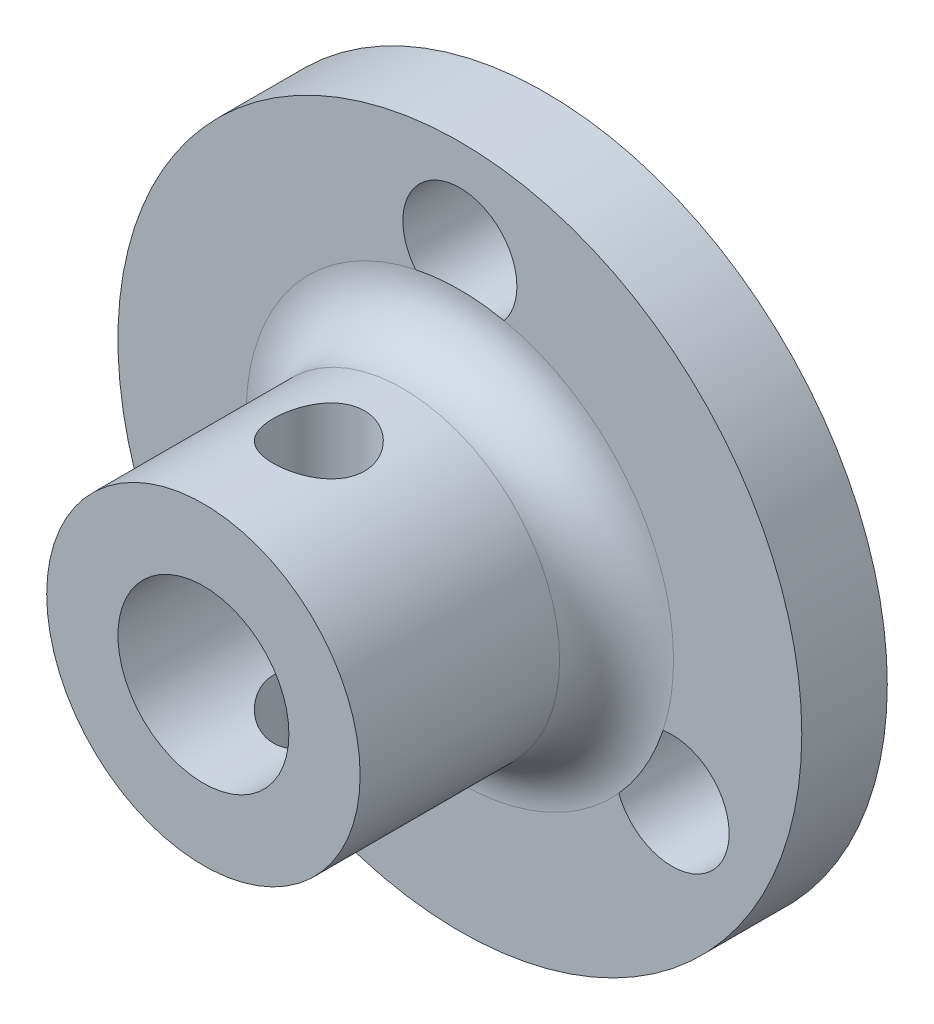
ISO-10303-21;
HEADER;
FILE_DESCRIPTION(('STEP AP214'),'2;1');
FILE_NAME('part.step','',(''),(''),'','','');
FILE_SCHEMA(('AUTOMOTIVE_DESIGN { 1 0 10303 214 1 1 1 1 }'));
ENDSEC;
DATA;
#1=APPLICATION_CONTEXT('core data for automotive mechanical design processes');
#2=APPLICATION_PROTOCOL_DEFINITION('international standard','automotive_design',2000,#1);
#3=PRODUCT_CONTEXT('',#1,'mechanical');
#4=PRODUCT('Part','Part','',(#3));
#5=PRODUCT_RELATED_PRODUCT_CATEGORY('part','',(#4));
#6=PRODUCT_DEFINITION_FORMATION('','',#4);
#7=PRODUCT_DEFINITION_CONTEXT('part definition',#1,'design');
#8=PRODUCT_DEFINITION('design','',#6,#7);
#9=PRODUCT_DEFINITION_SHAPE('','',#8);
#10=(LENGTH_UNIT() NAMED_UNIT(*) SI_UNIT(.MILLI.,.METRE.));
#11=(NAMED_UNIT(*) PLANE_ANGLE_UNIT() SI_UNIT($,.RADIAN.));
#12=(NAMED_UNIT(*) SI_UNIT($,.STERADIAN.) SOLID_ANGLE_UNIT());
#13=UNCERTAINTY_MEASURE_WITH_UNIT(LENGTH_MEASURE(1.E-05),#10,'distance_accuracy_value','');
#14=(GEOMETRIC_REPRESENTATION_CONTEXT(3) GLOBAL_UNCERTAINTY_ASSIGNED_CONTEXT((#13)) GLOBAL_UNIT_ASSIGNED_CONTEXT((#10,
#11,#12)) REPRESENTATION_CONTEXT('',''));
#15=CARTESIAN_POINT('',(0.,0.,0.));
#16=DIRECTION('',(0.,0.,1.));
#17=DIRECTION('',(1.,0.,0.));
#18=AXIS2_PLACEMENT_3D('',#15,#16,#17);
#19=CARTESIAN_POINT('',(0.,0.,12.));
#20=DIRECTION('',(0.,0.,-1.));
#21=DIRECTION('',(-1.,0.,0.));
#22=AXIS2_PLACEMENT_3D('',#19,#20,#21);
#23=CYLINDRICAL_SURFACE('',#22,3.);
#24=CARTESIAN_POINT('',(0.,-3.,6.34948666700832));
#25=CARTESIAN_POINT('',(0.0834280085828025,-2.99999516830785,6.34949208358249));
#26=CARTESIAN_POINT('',(0.166934582506535,-2.99648378720922,6.35604985983169));
#27=CARTESIAN_POINT('',(0.331436394670318,-2.98278259335468,6.38197006874192));
#28=CARTESIAN_POINT('',(0.412427539682874,-2.97258243738723,6.40135233301597));
#29=CARTESIAN_POINT('',(0.569277189891047,-2.94656073601314,6.45192634672432));
#30=CARTESIAN_POINT('',(0.645155024474136,-2.93076195982554,6.4830702953871));
#31=CARTESIAN_POINT('',(0.790470948459431,-2.89495499745187,6.55601177043328));
#32=CARTESIAN_POINT('',(0.859909008635982,-2.87494679216347,6.59780934516286));
#33=CARTESIAN_POINT('',(0.995534638915594,-2.83095801330151,6.69398979046827));
#34=CARTESIAN_POINT('',(1.06120405491229,-2.80680229614067,6.74902187403424));
#35=CARTESIAN_POINT('',(1.18286806133739,-2.75774084341935,6.8686929583954));
#36=CARTESIAN_POINT('',(1.23885417984541,-2.73283447325624,6.93334028052644));
#37=CARTESIAN_POINT('',(1.34470883896841,-2.68244281334124,7.07744278391342));
#38=CARTESIAN_POINT('',(1.39355367383636,-2.65711191284795,7.15771076412944));
#39=CARTESIAN_POINT('',(1.4768528324153,-2.6117367722112,7.32677802950124));
#40=CARTESIAN_POINT('',(1.51131827632936,-2.59168845125878,7.41557065656263));
#41=CARTESIAN_POINT('',(1.56248710339327,-2.56114789725882,7.59359520577738));
#42=CARTESIAN_POINT('',(1.5801662348633,-2.55013659138239,7.68245261120152));
#43=CARTESIAN_POINT('',(1.60018994479719,-2.53762662306211,7.86249441092746));
#44=CARTESIAN_POINT('',(1.60255389391569,-2.53611594428853,7.9536757192737));
#45=CARTESIAN_POINT('',(1.59259204330144,-2.54237297611912,8.12193039830425));
#46=CARTESIAN_POINT('',(1.5822864459542,-2.54886502713221,8.19918356025348));
#47=CARTESIAN_POINT('',(1.55082691014658,-2.56812634563423,8.35063591489162));
#48=CARTESIAN_POINT('',(1.52966860751486,-2.58089813829439,8.42483386601958));
#49=CARTESIAN_POINT('',(1.47678050478154,-2.6115255571428,8.57016272015564));
#50=CARTESIAN_POINT('',(1.44482388986181,-2.62948894800927,8.6411872731784));
#51=CARTESIAN_POINT('',(1.37143304593392,-2.66850094165746,8.77722571972306));
#52=CARTESIAN_POINT('',(1.32999461708737,-2.68955091010761,8.84223693174635));
#53=CARTESIAN_POINT('',(1.23173704487371,-2.73609049880501,8.97445838943488));
#54=CARTESIAN_POINT('',(1.17355258231979,-2.76177798986485,9.04058813750174));
#55=CARTESIAN_POINT('',(1.0469027467487,-2.81223117246244,9.16263738238821));
#56=CARTESIAN_POINT('',(0.978431146098924,-2.83699629420455,9.21855064859457));
#57=CARTESIAN_POINT('',(0.828044154062363,-2.88460021999069,9.32176209683673));
#58=CARTESIAN_POINT('',(0.745570968821584,-2.90723646176344,9.36834888339614));
#59=CARTESIAN_POINT('',(0.572453719472289,-2.9462079060851,9.44658243336212));
#60=CARTESIAN_POINT('',(0.481817034499116,-2.96254873003402,9.47824253101455));
#61=CARTESIAN_POINT('',(0.30366442791181,-2.9858199122846,9.52284189182288));
#62=CARTESIAN_POINT('',(0.216600262764062,-2.99346409984953,9.53720806962829));
#63=CARTESIAN_POINT('',(0.0409791950824068,-3.00100442054404,9.55138167340918));
#64=CARTESIAN_POINT('',(-0.0475768145688012,-3.00090503432182,9.5511975186129));
#65=CARTESIAN_POINT('',(-0.215091919521215,-2.99334764517664,9.53698680934697));
#66=CARTESIAN_POINT('',(-0.294192898535464,-2.98655794488573,9.5242173855118));
#67=CARTESIAN_POINT('',(-0.448939109663164,-2.96724376655693,9.48727178281248));
#68=CARTESIAN_POINT('',(-0.524583981374494,-2.95471869192973,9.46309441729492));
#69=CARTESIAN_POINT('',(-0.672500335044405,-2.92465141623378,9.40353678207186));
#70=CARTESIAN_POINT('',(-0.744640666753739,-2.9069918992478,9.36789219717175));
#71=CARTESIAN_POINT('',(-0.882124314821924,-2.86826876163522,9.28673635840511));
#72=CARTESIAN_POINT('',(-0.94746496400545,-2.84720381343929,9.24122125425453));
#73=CARTESIAN_POINT('',(-1.07697928921282,-2.80095291390707,9.13599706479286));
#74=CARTESIAN_POINT('',(-1.1402697302165,-2.77556745933858,9.0752873323506));
#75=CARTESIAN_POINT('',(-1.25621972548301,-2.72505417098626,8.94426099517801));
#76=CARTESIAN_POINT('',(-1.30886943094942,-2.69992659611925,8.87393559042423));
#77=CARTESIAN_POINT('',(-1.40548153261782,-2.65099028655931,8.71983369465826));
#78=CARTESIAN_POINT('',(-1.44862048937835,-2.62738421458254,8.63547038944949));
#79=CARTESIAN_POINT('',(-1.51964969635315,-2.58695870125936,8.45906648683598));
#80=CARTESIAN_POINT('',(-1.54756166073897,-2.57012960475316,8.36703703876482));
#81=CARTESIAN_POINT('',(-1.5845909036139,-2.54745026922036,8.18745897281323));
#82=CARTESIAN_POINT('',(-1.59528122309048,-2.54068617365327,8.10035429957741));
#83=CARTESIAN_POINT('',(-1.60220766902338,-2.53632719775287,7.92536603864759));
#84=CARTESIAN_POINT('',(-1.59845364948012,-2.53872606639137,7.83748302276316));
#85=CARTESIAN_POINT('',(-1.57811270148832,-2.55140495355656,7.67479395729224));
#86=CARTESIAN_POINT('',(-1.56314118274069,-2.5606915110498,7.5996968855534));
#87=CARTESIAN_POINT('',(-1.52298687295876,-2.58477383442181,7.45321875192609));
#88=CARTESIAN_POINT('',(-1.4978002949924,-2.59957164326813,7.38183907923955));
#89=CARTESIAN_POINT('',(-1.43616070422438,-2.63415331148715,7.23967710791558));
#90=CARTESIAN_POINT('',(-1.3990864148575,-2.65419696823125,7.16922953217823));
#91=CARTESIAN_POINT('',(-1.31534245335434,-2.6966792141344,7.03508279548737));
#92=CARTESIAN_POINT('',(-1.26866761463333,-2.71911908969112,6.97138729628419));
#93=CARTESIAN_POINT('',(-1.15916720525938,-2.76774539611286,6.84294047925392));
#94=CARTESIAN_POINT('',(-1.09498203667427,-2.79400424140764,6.77936918613531));
#95=CARTESIAN_POINT('',(-0.956300329149746,-2.8444566012759,6.66354212620747));
#96=CARTESIAN_POINT('',(-0.881797165766555,-2.86864877272258,6.61129368470821));
#97=CARTESIAN_POINT('',(-0.722044005153541,-2.91302030182076,6.51861874724413));
#98=CARTESIAN_POINT('',(-0.636577331123639,-2.93308821046928,6.47850941454085));
#99=CARTESIAN_POINT('',(-0.458798662878496,-2.9660771301132,6.41377942189835));
#100=CARTESIAN_POINT('',(-0.36650569376879,-2.97901721406285,6.38911740282482));
#101=CARTESIAN_POINT('',(-0.227615355842192,-2.99169552229494,6.36510132443239));
#102=CARTESIAN_POINT('',(-0.182355494246517,-2.9947988863485,6.35925689859637));
#103=CARTESIAN_POINT('',(-0.0914049548856031,-2.9989524612278,6.35144806269995));
#104=CARTESIAN_POINT('',(-0.0457142719789323,-3.00000264751962,6.34948369900334));
#105=CARTESIAN_POINT('',(0.,-3.,6.34948666700832));
#106=B_SPLINE_CURVE_WITH_KNOTS('',3,(#24,#25,#26,#27,#28,#29,#30,#31,#32,#33,#34,#35,#36,#37,
#38,#39,#40,#41,#42,#43,#44,#45,#46,#47,#48,#49,#50,#51,#52,#53,#54,#55,#56,#57,#58,#59,#60,#61,
#62,#63,#64,#65,#66,#67,#68,#69,#70,#71,#72,#73,#74,#75,#76,#77,#78,#79,#80,#81,#82,#83,#84,#85,
#86,#87,#88,#89,#90,#91,#92,#93,#94,#95,#96,#97,#98,#99,#100,#101,#102,#103,#104,#105),
.UNSPECIFIED.,.T.,.F.,(4,2,2,2,2,2,2,2,2,2,2,2,2,2,2,2,2,2,2,2,2,2,2,2,2,2,2,2,2,2,2,2,2,2,2,2,
2,2,2,2,4),(0.,0.250099571937984,0.500586801159414,0.750066790862757,0.99954791272674,
1.26551787503545,1.53171937023862,1.82220042181316,2.11245641359362,2.38456600858369,
2.65633137184324,2.88985639109234,3.12347539088301,3.3623427439711,3.60131610556615,
3.87540340557937,4.14965730631696,4.44024459698544,4.7305718072894,4.99480330643343,
5.2588819149833,5.49900649956853,5.73915606740714,5.98529384057671,6.2315278002262,
6.50427545175262,6.77727440700572,7.06865169074469,7.3596123678454,7.62207574902765,
7.8843601081339,8.1147617764152,8.34524893751089,8.59058452776185,8.83605249367796,
9.11702751803745,9.39818377987291,9.68615329689657,9.9733484617649,10.110388568954,
10.2474303136582),.UNSPECIFIED.);
#107=CARTESIAN_POINT('',(0.,-3.,6.34948666700832));
#108=VERTEX_POINT('',#107);
#109=EDGE_CURVE('E126',#108,#108,#106,.T.);
#110=ORIENTED_EDGE('',*,*,#109,.T.);
#111=EDGE_LOOP('',(#110));
#112=FACE_BOUND('',#111,.T.);
#113=CARTESIAN_POINT('',(0.,0.,12.));
#114=DIRECTION('',(0.,0.,1.));
#115=DIRECTION('',(1.,0.,0.));
#116=AXIS2_PLACEMENT_3D('',#113,#114,#115);
#117=CIRCLE('',#116,3.);
#118=CARTESIAN_POINT('',(3.,0.,12.));
#119=VERTEX_POINT('',#118);
#120=EDGE_CURVE('E166',#119,#119,#117,.T.);
#121=ORIENTED_EDGE('',*,*,#120,.T.);
#122=EDGE_LOOP('',(#121));
#123=FACE_BOUND('',#122,.T.);
#124=CARTESIAN_POINT('',(0.,0.,0.));
#125=DIRECTION('',(0.,0.,1.));
#126=DIRECTION('',(1.,0.,0.));
#127=AXIS2_PLACEMENT_3D('',#124,#125,#126);
#128=CIRCLE('',#127,3.);
#129=CARTESIAN_POINT('',(3.,0.,0.));
#130=VERTEX_POINT('',#129);
#131=EDGE_CURVE('E169',#130,#130,#128,.T.);
#132=ORIENTED_EDGE('',*,*,#131,.F.);
#133=EDGE_LOOP('',(#132));
#134=FACE_BOUND('',#133,.T.);
#135=CARTESIAN_POINT('',(0.,3.,6.34948666700832));
#136=CARTESIAN_POINT('',(-0.0834280085828025,2.99999516830785,6.34949208358249));
#137=CARTESIAN_POINT('',(-0.166934582506535,2.99648378720922,6.35604985983169));
#138=CARTESIAN_POINT('',(-0.331436394670318,2.98278259335468,6.38197006874192));
#139=CARTESIAN_POINT('',(-0.412427539682874,2.97258243738723,6.40135233301597));
#140=CARTESIAN_POINT('',(-0.569277189891047,2.94656073601314,6.45192634672432));
#141=CARTESIAN_POINT('',(-0.645155024474136,2.93076195982554,6.4830702953871));
#142=CARTESIAN_POINT('',(-0.790470948459431,2.89495499745187,6.55601177043328));
#143=CARTESIAN_POINT('',(-0.859909008635982,2.87494679216347,6.59780934516286));
#144=CARTESIAN_POINT('',(-0.995534638915594,2.83095801330151,6.69398979046827));
#145=CARTESIAN_POINT('',(-1.06120405491229,2.80680229614067,6.74902187403424));
#146=CARTESIAN_POINT('',(-1.18286806133739,2.75774084341935,6.8686929583954));
#147=CARTESIAN_POINT('',(-1.23885417984541,2.73283447325624,6.93334028052644));
#148=CARTESIAN_POINT('',(-1.34470883896841,2.68244281334124,7.07744278391342));
#149=CARTESIAN_POINT('',(-1.39355367383636,2.65711191284795,7.15771076412944));
#150=CARTESIAN_POINT('',(-1.4768528324153,2.6117367722112,7.32677802950124));
#151=CARTESIAN_POINT('',(-1.51131827632936,2.59168845125878,7.41557065656263));
#152=CARTESIAN_POINT('',(-1.56248710339327,2.56114789725882,7.59359520577738));
#153=CARTESIAN_POINT('',(-1.5801662348633,2.55013659138239,7.68245261120152));
#154=CARTESIAN_POINT('',(-1.60018994479719,2.53762662306211,7.86249441092746));
#155=CARTESIAN_POINT('',(-1.60255389391569,2.53611594428853,7.9536757192737));
#156=CARTESIAN_POINT('',(-1.59259204330144,2.54237297611912,8.12193039830425));
#157=CARTESIAN_POINT('',(-1.5822864459542,2.54886502713221,8.19918356025348));
#158=CARTESIAN_POINT('',(-1.55082691014658,2.56812634563423,8.35063591489162));
#159=CARTESIAN_POINT('',(-1.52966860751486,2.58089813829439,8.42483386601958));
#160=CARTESIAN_POINT('',(-1.47678050478154,2.6115255571428,8.57016272015564));
#161=CARTESIAN_POINT('',(-1.44482388986181,2.62948894800927,8.6411872731784));
#162=CARTESIAN_POINT('',(-1.37143304593392,2.66850094165746,8.77722571972306));
#163=CARTESIAN_POINT('',(-1.32999461708737,2.68955091010761,8.84223693174635));
#164=CARTESIAN_POINT('',(-1.23173704487371,2.73609049880501,8.97445838943488));
#165=CARTESIAN_POINT('',(-1.17355258231979,2.76177798986485,9.04058813750174));
#166=CARTESIAN_POINT('',(-1.0469027467487,2.81223117246244,9.16263738238821));
#167=CARTESIAN_POINT('',(-0.978431146098924,2.83699629420455,9.21855064859457));
#168=CARTESIAN_POINT('',(-0.828044154062363,2.88460021999069,9.32176209683673));
#169=CARTESIAN_POINT('',(-0.745570968821584,2.90723646176344,9.36834888339614));
#170=CARTESIAN_POINT('',(-0.572453719472289,2.9462079060851,9.44658243336212));
#171=CARTESIAN_POINT('',(-0.481817034499116,2.96254873003402,9.47824253101455));
#172=CARTESIAN_POINT('',(-0.30366442791181,2.9858199122846,9.52284189182288));
#173=CARTESIAN_POINT('',(-0.216600262764062,2.99346409984953,9.53720806962829));
#174=CARTESIAN_POINT('',(-0.0409791950824068,3.00100442054404,9.55138167340918));
#175=CARTESIAN_POINT('',(0.0475768145688012,3.00090503432182,9.5511975186129));
#176=CARTESIAN_POINT('',(0.215091919521215,2.99334764517664,9.53698680934697));
#177=CARTESIAN_POINT('',(0.294192898535464,2.98655794488573,9.5242173855118));
#178=CARTESIAN_POINT('',(0.448939109663164,2.96724376655693,9.48727178281248));
#179=CARTESIAN_POINT('',(0.524583981374494,2.95471869192973,9.46309441729492));
#180=CARTESIAN_POINT('',(0.672500335044405,2.92465141623378,9.40353678207186));
#181=CARTESIAN_POINT('',(0.744640666753739,2.9069918992478,9.36789219717175));
#182=CARTESIAN_POINT('',(0.882124314821924,2.86826876163522,9.28673635840511));
#183=CARTESIAN_POINT('',(0.94746496400545,2.84720381343929,9.24122125425453));
#184=CARTESIAN_POINT('',(1.07697928921282,2.80095291390707,9.13599706479286));
#185=CARTESIAN_POINT('',(1.1402697302165,2.77556745933858,9.0752873323506));
#186=CARTESIAN_POINT('',(1.25621972548301,2.72505417098626,8.94426099517801));
#187=CARTESIAN_POINT('',(1.30886943094942,2.69992659611925,8.87393559042423));
#188=CARTESIAN_POINT('',(1.40548153261782,2.65099028655931,8.71983369465826));
#189=CARTESIAN_POINT('',(1.44862048937835,2.62738421458254,8.63547038944949));
#190=CARTESIAN_POINT('',(1.51964969635315,2.58695870125936,8.45906648683598));
#191=CARTESIAN_POINT('',(1.54756166073897,2.57012960475316,8.36703703876482));
#192=CARTESIAN_POINT('',(1.5845909036139,2.54745026922036,8.18745897281323));
#193=CARTESIAN_POINT('',(1.59528122309048,2.54068617365327,8.10035429957741));
#194=CARTESIAN_POINT('',(1.60220766902338,2.53632719775287,7.92536603864759));
#195=CARTESIAN_POINT('',(1.59845364948012,2.53872606639137,7.83748302276316));
#196=CARTESIAN_POINT('',(1.57811270148832,2.55140495355656,7.67479395729224));
#197=CARTESIAN_POINT('',(1.56314118274069,2.5606915110498,7.5996968855534));
#198=CARTESIAN_POINT('',(1.52298687295876,2.58477383442181,7.45321875192609));
#199=CARTESIAN_POINT('',(1.4978002949924,2.59957164326813,7.38183907923955));
#200=CARTESIAN_POINT('',(1.43616070422438,2.63415331148715,7.23967710791558));
#201=CARTESIAN_POINT('',(1.3990864148575,2.65419696823125,7.16922953217823));
#202=CARTESIAN_POINT('',(1.31534245335434,2.6966792141344,7.03508279548737));
#203=CARTESIAN_POINT('',(1.26866761463333,2.71911908969112,6.97138729628419));
#204=CARTESIAN_POINT('',(1.15916720525938,2.76774539611286,6.84294047925392));
#205=CARTESIAN_POINT('',(1.09498203667427,2.79400424140764,6.77936918613531));
#206=CARTESIAN_POINT('',(0.956300329149746,2.8444566012759,6.66354212620747));
#207=CARTESIAN_POINT('',(0.881797165766555,2.86864877272258,6.61129368470821));
#208=CARTESIAN_POINT('',(0.722044005153541,2.91302030182076,6.51861874724413));
#209=CARTESIAN_POINT('',(0.636577331123639,2.93308821046928,6.47850941454085));
#210=CARTESIAN_POINT('',(0.458798662878496,2.9660771301132,6.41377942189835));
#211=CARTESIAN_POINT('',(0.36650569376879,2.97901721406285,6.38911740282482));
#212=CARTESIAN_POINT('',(0.227615355842192,2.99169552229494,6.36510132443239));
#213=CARTESIAN_POINT('',(0.182355494246517,2.9947988863485,6.35925689859637));
#214=CARTESIAN_POINT('',(0.0914049548856031,2.9989524612278,6.35144806269995));
#215=CARTESIAN_POINT('',(0.0457142719789323,3.00000264751962,6.34948369900334));
#216=CARTESIAN_POINT('',(0.,3.,6.34948666700832));
#217=B_SPLINE_CURVE_WITH_KNOTS('',3,(#135,#136,#137,#138,#139,#140,#141,#142,#143,#144,#145,
#146,#147,#148,#149,#150,#151,#152,#153,#154,#155,#156,#157,#158,#159,#160,#161,#162,#163,#164,
#165,#166,#167,#168,#169,#170,#171,#172,#173,#174,#175,#176,#177,#178,#179,#180,#181,#182,#183,
#184,#185,#186,#187,#188,#189,#190,#191,#192,#193,#194,#195,#196,#197,#198,#199,#200,#201,#202,
#203,#204,#205,#206,#207,#208,#209,#210,#211,#212,#213,#214,#215,#216),.UNSPECIFIED.,.T.,.F.,(4,
2,2,2,2,2,2,2,2,2,2,2,2,2,2,2,2,2,2,2,2,2,2,2,2,2,2,2,2,2,2,2,2,2,2,2,2,2,2,2,4),(0.,
0.250099571937984,0.500586801159414,0.750066790862757,0.99954791272674,1.26551787503545,
1.53171937023862,1.82220042181316,2.11245641359362,2.38456600858369,2.65633137184324,
2.88985639109234,3.12347539088301,3.3623427439711,3.60131610556615,3.87540340557937,
4.14965730631696,4.44024459698544,4.7305718072894,4.99480330643343,5.2588819149833,
5.49900649956853,5.73915606740714,5.98529384057671,6.2315278002262,6.50427545175262,
6.77727440700572,7.06865169074469,7.3596123678454,7.62207574902765,7.8843601081339,
8.1147617764152,8.34524893751089,8.59058452776185,8.83605249367796,9.11702751803745,
9.39818377987291,9.68615329689657,9.9733484617649,10.110388568954,10.2474303136582),.UNSPECIFIED.);
#218=CARTESIAN_POINT('',(0.,3.,6.34948666700832));
#219=VERTEX_POINT('',#218);
#220=EDGE_CURVE('E132',#219,#219,#217,.T.);
#221=ORIENTED_EDGE('',*,*,#220,.T.);
#222=EDGE_LOOP('',(#221));
#223=FACE_BOUND('',#222,.T.);
#224=ADVANCED_FACE('F35',(#112,#123,#134,#223),#23,.F.);
#225=CARTESIAN_POINT('',(0.,0.,12.));
#226=DIRECTION('',(0.,0.,-1.));
#227=DIRECTION('',(-1.,0.,0.));
#228=AXIS2_PLACEMENT_3D('',#225,#226,#227);
#229=CYLINDRICAL_SURFACE('',#228,5.5);
#230=CARTESIAN_POINT('',(0.,0.,5.));
#231=DIRECTION('',(0.,0.,1.));
#232=DIRECTION('',(1.,0.,0.));
#233=AXIS2_PLACEMENT_3D('',#230,#231,#232);
#234=CIRCLE('',#233,5.5);
#235=CARTESIAN_POINT('',(5.5,0.,5.));
#236=VERTEX_POINT('',#235);
#237=EDGE_CURVE('E101',#236,#236,#234,.T.);
#238=ORIENTED_EDGE('',*,*,#237,.T.);
#239=EDGE_LOOP('',(#238));
#240=FACE_BOUND('',#239,.T.);
#241=CARTESIAN_POINT('',(0.,0.,12.));
#242=DIRECTION('',(0.,0.,1.));
#243=DIRECTION('',(1.,0.,0.));
#244=AXIS2_PLACEMENT_3D('',#241,#242,#243);
#245=CIRCLE('',#244,5.5);
#246=CARTESIAN_POINT('',(5.5,0.,12.));
#247=VERTEX_POINT('',#246);
#248=EDGE_CURVE('E163',#247,#247,#245,.T.);
#249=ORIENTED_EDGE('',*,*,#248,.F.);
#250=EDGE_LOOP('',(#249));
#251=FACE_BOUND('',#250,.T.);
#252=CARTESIAN_POINT('',(0.,-5.5,6.34948666700832));
#253=CARTESIAN_POINT('',(0.0878959926890056,-5.4999990518237,6.34948804999109));
#254=CARTESIAN_POINT('',(0.175806085583694,-5.49787267544624,6.35675361600206));
#255=CARTESIAN_POINT('',(0.349073985508154,-5.48959750284409,6.38555994625341));
#256=CARTESIAN_POINT('',(0.434430889479695,-5.48344730058792,6.40710570040458));
#257=CARTESIAN_POINT('',(0.600067756273106,-5.46779977682029,6.46369779623774));
#258=CARTESIAN_POINT('',(0.680354757585185,-5.4583072215572,6.49872491986073));
#259=CARTESIAN_POINT('',(0.833915844301995,-5.43696627416899,6.58120876472044));
#260=CARTESIAN_POINT('',(0.90718912203063,-5.425117611205,6.62866691512548));
#261=CARTESIAN_POINT('',(1.04663300272226,-5.39997279501187,6.73602474340415));
#262=CARTESIAN_POINT('',(1.11258611595363,-5.38664833166273,6.79620027101284));
#263=CARTESIAN_POINT('',(1.23362144670291,-5.36022610122049,6.9266963011524));
#264=CARTESIAN_POINT('',(1.28870196448521,-5.34712836986439,6.99701838694621));
#265=CARTESIAN_POINT('',(1.38754894314195,-5.32234596280303,7.14762189820788));
#266=CARTESIAN_POINT('',(1.43105429253015,-5.31069662584938,7.22808105942857));
#267=CARTESIAN_POINT('',(1.50382981578722,-5.29055119125395,7.39556671894096));
#268=CARTESIAN_POINT('',(1.5331031786821,-5.28205438731091,7.48259174093699));
#269=CARTESIAN_POINT('',(1.57580767682952,-5.26947030749288,7.6583055991513));
#270=CARTESIAN_POINT('',(1.58963795218677,-5.26527217972364,7.74688928441522));
#271=CARTESIAN_POINT('',(1.60230954247495,-5.26143058940414,7.92521141345618));
#272=CARTESIAN_POINT('',(1.60115424719639,-5.26178609680484,8.01494959149471));
#273=CARTESIAN_POINT('',(1.58420194419316,-5.26691308588751,8.189825557806));
#274=CARTESIAN_POINT('',(1.56890000439759,-5.27153524590158,8.27501643193932));
#275=CARTESIAN_POINT('',(1.5248866705396,-5.28443387237583,8.44156561678656));
#276=CARTESIAN_POINT('',(1.49617402441071,-5.29271068004168,8.52292356886566));
#277=CARTESIAN_POINT('',(1.42577888064556,-5.31210856656912,8.68073076709187));
#278=CARTESIAN_POINT('',(1.3839321797954,-5.32326531844177,8.7571021932384));
#279=CARTESIAN_POINT('',(1.28857102444839,-5.34714829219519,8.9019071134108));
#280=CARTESIAN_POINT('',(1.23505388911279,-5.35987487439257,8.97033877803563));
#281=CARTESIAN_POINT('',(1.11539165431842,-5.38607369451695,9.10013566999839));
#282=CARTESIAN_POINT('',(1.04883427392334,-5.39955562083306,9.16111947285163));
#283=CARTESIAN_POINT('',(0.906269887462729,-5.42530316429731,9.27114573502124));
#284=CARTESIAN_POINT('',(0.830262355621385,-5.43756871370187,9.32018752947344));
#285=CARTESIAN_POINT('',(0.670291257833208,-5.45960243201934,9.40515080400981));
#286=CARTESIAN_POINT('',(0.586282853741797,-5.46935523580978,9.44099211147043));
#287=CARTESIAN_POINT('',(0.41308195464912,-5.48515388088791,9.49792694286016));
#288=CARTESIAN_POINT('',(0.32389082270979,-5.49120069206717,9.51902432560973));
#289=CARTESIAN_POINT('',(0.146102374431445,-5.49875452656796,9.54524771698146));
#290=CARTESIAN_POINT('',(0.0575875010208899,-5.5004085556206,9.55089110696262));
#291=CARTESIAN_POINT('',(-0.119128121357843,-5.49941929543004,9.5474904149152));
#292=CARTESIAN_POINT('',(-0.20732890815039,-5.49677654247024,9.53844816580833));
#293=CARTESIAN_POINT('',(-0.378989988118207,-5.48758657715466,9.50635311223454));
#294=CARTESIAN_POINT('',(-0.462510950719447,-5.48112258446653,9.48359873411547));
#295=CARTESIAN_POINT('',(-0.624534787515059,-5.46503343330605,9.42508082536497));
#296=CARTESIAN_POINT('',(-0.70303707132774,-5.45540790373483,9.38931576749656));
#297=CARTESIAN_POINT('',(-0.85472926827078,-5.43373196590243,9.30489775239504));
#298=CARTESIAN_POINT('',(-0.927762598046088,-5.42163247833979,9.25597636206203));
#299=CARTESIAN_POINT('',(-1.06476116805978,-5.39640103270706,9.14696363370224));
#300=CARTESIAN_POINT('',(-1.12872426325146,-5.38326883154519,9.08686966117827));
#301=CARTESIAN_POINT('',(-1.24801794766004,-5.35689415850173,8.95479011112209));
#302=CARTESIAN_POINT('',(-1.3029811098147,-5.3436631170658,8.88246969936346));
#303=CARTESIAN_POINT('',(-1.40001203707105,-5.31906767995036,8.72934573128499));
#304=CARTESIAN_POINT('',(-1.44208021539903,-5.30770322446059,8.64854244691452));
#305=CARTESIAN_POINT('',(-1.51182598667628,-5.2882600680365,8.48105609291014));
#306=CARTESIAN_POINT('',(-1.53957690975201,-5.28016467097066,8.39440560812961));
#307=CARTESIAN_POINT('',(-1.58002104031168,-5.26820528008861,8.21738511731711));
#308=CARTESIAN_POINT('',(-1.59271902136439,-5.26433994487076,8.12701629984913));
#309=CARTESIAN_POINT('',(-1.60238579623394,-5.26140494243124,7.94892506738571));
#310=CARTESIAN_POINT('',(-1.59995101676212,-5.26215342138962,7.86123758356649));
#311=CARTESIAN_POINT('',(-1.58083368870924,-5.26792771290673,7.68758055985748));
#312=CARTESIAN_POINT('',(-1.56415164871066,-5.27295337278351,7.60161095875676));
#313=CARTESIAN_POINT('',(-1.51738781107183,-5.28659750790534,7.43474113746398));
#314=CARTESIAN_POINT('',(-1.48745498991143,-5.29517597227329,7.35379565792603));
#315=CARTESIAN_POINT('',(-1.41515469085832,-5.31495395363785,7.19801137517941));
#316=CARTESIAN_POINT('',(-1.37278494612695,-5.32615394837703,7.12317368839961));
#317=CARTESIAN_POINT('',(-1.27510104111531,-5.35039522359373,6.97893890988445));
#318=CARTESIAN_POINT('',(-1.21939087460294,-5.36348668211837,6.90981844027135));
#319=CARTESIAN_POINT('',(-1.09733168103419,-5.38978242996598,6.78171370510171));
#320=CARTESIAN_POINT('',(-1.0309799493545,-5.40298674716289,6.72273202430117));
#321=CARTESIAN_POINT('',(-0.887368622820597,-5.4284463110724,6.61500247926018));
#322=CARTESIAN_POINT('',(-0.809863492979022,-5.44066644445546,6.56657281512564));
#323=CARTESIAN_POINT('',(-0.64745551698983,-5.46237080790901,6.48350225607997));
#324=CARTESIAN_POINT('',(-0.562556535101506,-5.47185645606653,6.44885421055351));
#325=CARTESIAN_POINT('',(-0.398559095538835,-5.48607998496091,6.39784419698092));
#326=CARTESIAN_POINT('',(-0.320031681661731,-5.49125834417518,6.37975718536237));
#327=CARTESIAN_POINT('',(-0.161006596679069,-5.49821853945562,6.35557865751001));
#328=CARTESIAN_POINT('',(-0.0805092132539735,-5.50000086849156,6.34948540025142));
#329=CARTESIAN_POINT('',(0.,-5.5,6.34948666700832));
#330=B_SPLINE_CURVE_WITH_KNOTS('',3,(#252,#253,#254,#255,#256,#257,#258,#259,#260,#261,#262,
#263,#264,#265,#266,#267,#268,#269,#270,#271,#272,#273,#274,#275,#276,#277,#278,#279,#280,#281,
#282,#283,#284,#285,#286,#287,#288,#289,#290,#291,#292,#293,#294,#295,#296,#297,#298,#299,#300,
#301,#302,#303,#304,#305,#306,#307,#308,#309,#310,#311,#312,#313,#314,#315,#316,#317,#318,#319,
#320,#321,#322,#323,#324,#325,#326,#327,#328,#329),.UNSPECIFIED.,.T.,.F.,(4,2,2,2,2,2,2,2,2,2,2,
2,2,2,2,2,2,2,2,2,2,2,2,2,2,2,2,2,2,2,2,2,2,2,2,2,2,2,4),(0.,0.26339238749598,0.526876860467932,
0.789987112051769,1.05312762614055,1.32270257552884,1.5923196348149,1.86758333104341,
2.14278531922193,2.41069679846211,2.67854767620971,2.93736597145256,3.196208435632,
3.4584253306978,3.72070252369837,3.99324547725547,4.26580360101093,4.53999081480504,
4.81410624066673,5.07892543795107,5.34371158556329,5.60293323026853,5.86218531309873,
6.12719160340689,6.3922604616903,6.66634126342792,6.94041328118915,7.21306726183037,
7.48563475565789,7.7475295392942,8.0094149744996,8.26842802859662,8.52748832152792,
8.79548243292642,9.06354476503305,9.33882258630506,9.61395739233518,9.85524931170683,
10.09650620233),.UNSPECIFIED.);
#331=CARTESIAN_POINT('',(0.,-5.5,6.34948666700832));
#332=VERTEX_POINT('',#331);
#333=EDGE_CURVE('E103',#332,#332,#330,.T.);
#334=ORIENTED_EDGE('',*,*,#333,.F.);
#335=EDGE_LOOP('',(#334));
#336=FACE_BOUND('',#335,.T.);
#337=CARTESIAN_POINT('',(0.,5.5,6.34948666700832));
#338=CARTESIAN_POINT('',(-0.0878959926890056,5.4999990518237,6.34948804999109));
#339=CARTESIAN_POINT('',(-0.175806085583694,5.49787267544624,6.35675361600206));
#340=CARTESIAN_POINT('',(-0.349073985508154,5.48959750284409,6.38555994625341));
#341=CARTESIAN_POINT('',(-0.434430889479695,5.48344730058792,6.40710570040458));
#342=CARTESIAN_POINT('',(-0.600067756273106,5.46779977682029,6.46369779623774));
#343=CARTESIAN_POINT('',(-0.680354757585185,5.4583072215572,6.49872491986073));
#344=CARTESIAN_POINT('',(-0.833915844301995,5.43696627416899,6.58120876472044));
#345=CARTESIAN_POINT('',(-0.90718912203063,5.425117611205,6.62866691512548));
#346=CARTESIAN_POINT('',(-1.04663300272226,5.39997279501187,6.73602474340415));
#347=CARTESIAN_POINT('',(-1.11258611595363,5.38664833166273,6.79620027101284));
#348=CARTESIAN_POINT('',(-1.23362144670291,5.36022610122049,6.9266963011524));
#349=CARTESIAN_POINT('',(-1.28870196448521,5.34712836986439,6.99701838694621));
#350=CARTESIAN_POINT('',(-1.38754894314195,5.32234596280303,7.14762189820788));
#351=CARTESIAN_POINT('',(-1.43105429253015,5.31069662584938,7.22808105942857));
#352=CARTESIAN_POINT('',(-1.50382981578722,5.29055119125395,7.39556671894096));
#353=CARTESIAN_POINT('',(-1.5331031786821,5.28205438731091,7.48259174093699));
#354=CARTESIAN_POINT('',(-1.57580767682952,5.26947030749288,7.6583055991513));
#355=CARTESIAN_POINT('',(-1.58963795218677,5.26527217972364,7.74688928441522));
#356=CARTESIAN_POINT('',(-1.60230954247495,5.26143058940414,7.92521141345618));
#357=CARTESIAN_POINT('',(-1.60115424719639,5.26178609680484,8.01494959149471));
#358=CARTESIAN_POINT('',(-1.58420194419316,5.26691308588751,8.189825557806));
#359=CARTESIAN_POINT('',(-1.56890000439759,5.27153524590158,8.27501643193932));
#360=CARTESIAN_POINT('',(-1.5248866705396,5.28443387237583,8.44156561678656));
#361=CARTESIAN_POINT('',(-1.49617402441071,5.29271068004168,8.52292356886566));
#362=CARTESIAN_POINT('',(-1.42577888064556,5.31210856656912,8.68073076709187));
#363=CARTESIAN_POINT('',(-1.3839321797954,5.32326531844177,8.7571021932384));
#364=CARTESIAN_POINT('',(-1.28857102444839,5.34714829219519,8.9019071134108));
#365=CARTESIAN_POINT('',(-1.23505388911279,5.35987487439257,8.97033877803563));
#366=CARTESIAN_POINT('',(-1.11539165431842,5.38607369451695,9.10013566999839));
#367=CARTESIAN_POINT('',(-1.04883427392334,5.39955562083306,9.16111947285163));
#368=CARTESIAN_POINT('',(-0.906269887462729,5.42530316429731,9.27114573502124));
#369=CARTESIAN_POINT('',(-0.830262355621385,5.43756871370187,9.32018752947344));
#370=CARTESIAN_POINT('',(-0.670291257833208,5.45960243201934,9.40515080400981));
#371=CARTESIAN_POINT('',(-0.586282853741797,5.46935523580978,9.44099211147043));
#372=CARTESIAN_POINT('',(-0.41308195464912,5.48515388088791,9.49792694286016));
#373=CARTESIAN_POINT('',(-0.32389082270979,5.49120069206717,9.51902432560973));
#374=CARTESIAN_POINT('',(-0.146102374431445,5.49875452656796,9.54524771698146));
#375=CARTESIAN_POINT('',(-0.0575875010208899,5.5004085556206,9.55089110696262));
#376=CARTESIAN_POINT('',(0.119128121357843,5.49941929543004,9.5474904149152));
#377=CARTESIAN_POINT('',(0.20732890815039,5.49677654247024,9.53844816580833));
#378=CARTESIAN_POINT('',(0.378989988118207,5.48758657715466,9.50635311223454));
#379=CARTESIAN_POINT('',(0.462510950719447,5.48112258446653,9.48359873411547));
#380=CARTESIAN_POINT('',(0.624534787515059,5.46503343330605,9.42508082536497));
#381=CARTESIAN_POINT('',(0.70303707132774,5.45540790373483,9.38931576749656));
#382=CARTESIAN_POINT('',(0.85472926827078,5.43373196590243,9.30489775239504));
#383=CARTESIAN_POINT('',(0.927762598046088,5.42163247833979,9.25597636206203));
#384=CARTESIAN_POINT('',(1.06476116805978,5.39640103270706,9.14696363370224));
#385=CARTESIAN_POINT('',(1.12872426325146,5.38326883154519,9.08686966117827));
#386=CARTESIAN_POINT('',(1.24801794766004,5.35689415850173,8.95479011112209));
#387=CARTESIAN_POINT('',(1.3029811098147,5.3436631170658,8.88246969936346));
#388=CARTESIAN_POINT('',(1.40001203707105,5.31906767995036,8.72934573128499));
#389=CARTESIAN_POINT('',(1.44208021539903,5.30770322446059,8.64854244691452));
#390=CARTESIAN_POINT('',(1.51182598667628,5.2882600680365,8.48105609291014));
#391=CARTESIAN_POINT('',(1.53957690975201,5.28016467097066,8.39440560812961));
#392=CARTESIAN_POINT('',(1.58002104031168,5.26820528008861,8.21738511731711));
#393=CARTESIAN_POINT('',(1.59271902136439,5.26433994487076,8.12701629984913));
#394=CARTESIAN_POINT('',(1.60238579623394,5.26140494243124,7.94892506738571));
#395=CARTESIAN_POINT('',(1.59995101676212,5.26215342138962,7.86123758356649));
#396=CARTESIAN_POINT('',(1.58083368870924,5.26792771290673,7.68758055985748));
#397=CARTESIAN_POINT('',(1.56415164871066,5.27295337278351,7.60161095875676));
#398=CARTESIAN_POINT('',(1.51738781107183,5.28659750790534,7.43474113746398));
#399=CARTESIAN_POINT('',(1.48745498991143,5.29517597227329,7.35379565792603));
#400=CARTESIAN_POINT('',(1.41515469085832,5.31495395363785,7.19801137517941));
#401=CARTESIAN_POINT('',(1.37278494612695,5.32615394837703,7.12317368839961));
#402=CARTESIAN_POINT('',(1.27510104111531,5.35039522359373,6.97893890988445));
#403=CARTESIAN_POINT('',(1.21939087460294,5.36348668211837,6.90981844027135));
#404=CARTESIAN_POINT('',(1.09733168103419,5.38978242996598,6.78171370510171));
#405=CARTESIAN_POINT('',(1.0309799493545,5.40298674716289,6.72273202430117));
#406=CARTESIAN_POINT('',(0.887368622820597,5.4284463110724,6.61500247926018));
#407=CARTESIAN_POINT('',(0.809863492979022,5.44066644445546,6.56657281512564));
#408=CARTESIAN_POINT('',(0.64745551698983,5.46237080790901,6.48350225607997));
#409=CARTESIAN_POINT('',(0.562556535101506,5.47185645606653,6.44885421055351));
#410=CARTESIAN_POINT('',(0.398559095538835,5.48607998496091,6.39784419698092));
#411=CARTESIAN_POINT('',(0.320031681661731,5.49125834417518,6.37975718536237));
#412=CARTESIAN_POINT('',(0.161006596679069,5.49821853945562,6.35557865751001));
#413=CARTESIAN_POINT('',(0.0805092132539735,5.50000086849156,6.34948540025142));
#414=CARTESIAN_POINT('',(0.,5.5,6.34948666700832));
#415=B_SPLINE_CURVE_WITH_KNOTS('',3,(#337,#338,#339,#340,#341,#342,#343,#344,#345,#346,#347,
#348,#349,#350,#351,#352,#353,#354,#355,#356,#357,#358,#359,#360,#361,#362,#363,#364,#365,#366,
#367,#368,#369,#370,#371,#372,#373,#374,#375,#376,#377,#378,#379,#380,#381,#382,#383,#384,#385,
#386,#387,#388,#389,#390,#391,#392,#393,#394,#395,#396,#397,#398,#399,#400,#401,#402,#403,#404,
#405,#406,#407,#408,#409,#410,#411,#412,#413,#414),.UNSPECIFIED.,.T.,.F.,(4,2,2,2,2,2,2,2,2,2,2,
2,2,2,2,2,2,2,2,2,2,2,2,2,2,2,2,2,2,2,2,2,2,2,2,2,2,2,4),(0.,0.26339238749598,0.526876860467932,
0.789987112051769,1.05312762614055,1.32270257552884,1.5923196348149,1.86758333104341,
2.14278531922193,2.41069679846211,2.67854767620971,2.93736597145256,3.196208435632,
3.4584253306978,3.72070252369837,3.99324547725547,4.26580360101093,4.53999081480504,
4.81410624066673,5.07892543795107,5.34371158556329,5.60293323026853,5.86218531309873,
6.12719160340689,6.3922604616903,6.66634126342792,6.94041328118915,7.21306726183037,
7.48563475565789,7.7475295392942,8.0094149744996,8.26842802859662,8.52748832152792,
8.79548243292642,9.06354476503305,9.33882258630506,9.61395739233518,9.85524931170683,
10.09650620233),.UNSPECIFIED.);
#416=CARTESIAN_POINT('',(0.,5.5,6.34948666700832));
#417=VERTEX_POINT('',#416);
#418=EDGE_CURVE('E39',#417,#417,#415,.T.);
#419=ORIENTED_EDGE('',*,*,#418,.F.);
#420=EDGE_LOOP('',(#419));
#421=FACE_BOUND('',#420,.T.);
#422=ADVANCED_FACE('F109',(#240,#251,#336,#421),#229,.T.);
#423=CARTESIAN_POINT('',(0.,0.,3.));
#424=DIRECTION('',(0.,0.,-1.));
#425=DIRECTION('',(-1.,0.,0.));
#426=AXIS2_PLACEMENT_3D('',#423,#424,#425);
#427=CYLINDRICAL_SURFACE('',#426,12.);
#428=CARTESIAN_POINT('',(0.,0.,3.));
#429=DIRECTION('',(0.,0.,1.));
#430=DIRECTION('',(1.,0.,0.));
#431=AXIS2_PLACEMENT_3D('',#428,#429,#430);
#432=CIRCLE('',#431,12.);
#433=CARTESIAN_POINT('',(12.,0.,3.));
#434=VERTEX_POINT('',#433);
#435=EDGE_CURVE('E158',#434,#434,#432,.T.);
#436=ORIENTED_EDGE('',*,*,#435,.F.);
#437=EDGE_LOOP('',(#436));
#438=FACE_BOUND('',#437,.T.);
#439=CARTESIAN_POINT('',(0.,0.,0.));
#440=DIRECTION('',(0.,0.,1.));
#441=DIRECTION('',(1.,0.,0.));
#442=AXIS2_PLACEMENT_3D('',#439,#440,#441);
#443=CIRCLE('',#442,12.);
#444=CARTESIAN_POINT('',(12.,0.,0.));
#445=VERTEX_POINT('',#444);
#446=EDGE_CURVE('E161',#445,#445,#443,.T.);
#447=ORIENTED_EDGE('',*,*,#446,.T.);
#448=EDGE_LOOP('',(#447));
#449=FACE_BOUND('',#448,.T.);
#450=ADVANCED_FACE('F146',(#438,#449),#427,.T.);
#451=CARTESIAN_POINT('',(0.,0.,3.));
#452=DIRECTION('',(0.,0.,1.));
#453=DIRECTION('',(1.,0.,0.));
#454=AXIS2_PLACEMENT_3D('',#451,#452,#453);
#455=PLANE('',#454);
#456=CARTESIAN_POINT('',(5.95285057062218E-13,8.59983942329012,3.));
#457=DIRECTION('',(0.,0.,1.));
#458=DIRECTION('',(1.,0.,0.));
#459=AXIS2_PLACEMENT_3D('',#456,#457,#458);
#460=CIRCLE('',#459,2.00115174939698);
#461=CARTESIAN_POINT('',(1.55277348172436,7.33749920030344,3.));
#462=VERTEX_POINT('',#461);
#463=CARTESIAN_POINT('',(-1.55277348172334,7.33749920030365,3.));
#464=VERTEX_POINT('',#463);
#465=EDGE_CURVE('E297',#462,#464,#460,.T.);
#466=ORIENTED_EDGE('',*,*,#465,.F.);
#467=CARTESIAN_POINT('',(0.,0.,3.));
#468=DIRECTION('',(0.,0.,1.));
#469=DIRECTION('',(1.,0.,0.));
#470=AXIS2_PLACEMENT_3D('',#467,#468,#469);
#471=CIRCLE('',#470,7.5);
#472=CARTESIAN_POINT('',(7.13084744857289,-2.32400831865585,3.));
#473=VERTEX_POINT('',#472);
#474=EDGE_CURVE('E51',#462,#473,#471,.F.);
#475=ORIENTED_EDGE('',*,*,#474,.T.);
#476=CARTESIAN_POINT('',(7.44767940903642,-4.29991971164525,3.));
#477=DIRECTION('',(0.,0.,1.));
#478=DIRECTION('',(1.,0.,0.));
#479=AXIS2_PLACEMENT_3D('',#476,#477,#478);
#480=CIRCLE('',#479,2.00115174939746);
#481=CARTESIAN_POINT('',(5.57807396684872,-5.0134908816477,3.));
#482=VERTEX_POINT('',#481);
#483=EDGE_CURVE('E94',#482,#473,#480,.T.);
#484=ORIENTED_EDGE('',*,*,#483,.F.);
#485=CARTESIAN_POINT('',(-5.5780739668483,-5.01349088164816,3.));
#486=VERTEX_POINT('',#485);
#487=EDGE_CURVE('E49',#482,#486,#471,.F.);
#488=ORIENTED_EDGE('',*,*,#487,.T.);
#489=CARTESIAN_POINT('',(-7.44767940903591,-4.29991971164487,3.));
#490=DIRECTION('',(0.,0.,1.));
#491=DIRECTION('',(1.,0.,0.));
#492=AXIS2_PLACEMENT_3D('',#489,#490,#491);
#493=CIRCLE('',#492,2.00115174939768);
#494=CARTESIAN_POINT('',(-7.13084744857312,-2.32400831865512,3.));
#495=VERTEX_POINT('',#494);
#496=EDGE_CURVE('E64',#495,#486,#493,.T.);
#497=ORIENTED_EDGE('',*,*,#496,.F.);
#498=EDGE_CURVE('E84',#495,#464,#471,.F.);
#499=ORIENTED_EDGE('',*,*,#498,.T.);
#500=EDGE_LOOP('',(#466,#475,#484,#488,#497,#499));
#501=FACE_BOUND('',#500,.T.);
#502=ORIENTED_EDGE('',*,*,#435,.T.);
#503=EDGE_LOOP('',(#502));
#504=FACE_BOUND('',#503,.T.);
#505=ADVANCED_FACE('F91',(#501,#504),#455,.T.);
#506=CARTESIAN_POINT('',(0.,0.,0.));
#507=DIRECTION('',(0.,0.,1.));
#508=DIRECTION('',(1.,0.,0.));
#509=AXIS2_PLACEMENT_3D('',#506,#507,#508);
#510=PLANE('',#509);
#511=CARTESIAN_POINT('',(5.95285057062218E-13,8.59983942329012,0.));
#512=DIRECTION('',(0.,0.,1.));
#513=DIRECTION('',(1.,0.,0.));
#514=AXIS2_PLACEMENT_3D('',#511,#512,#513);
#515=CIRCLE('',#514,2.00115174939698);
#516=CARTESIAN_POINT('',(2.00115174939758,8.59983942329012,0.));
#517=VERTEX_POINT('',#516);
#518=EDGE_CURVE('E108',#517,#517,#515,.T.);
#519=ORIENTED_EDGE('',*,*,#518,.T.);
#520=EDGE_LOOP('',(#519));
#521=FACE_BOUND('',#520,.T.);
#522=CARTESIAN_POINT('',(7.44767940903642,-4.29991971164525,0.));
#523=DIRECTION('',(0.,0.,1.));
#524=DIRECTION('',(1.,0.,0.));
#525=AXIS2_PLACEMENT_3D('',#522,#523,#524);
#526=CIRCLE('',#525,2.00115174939746);
#527=CARTESIAN_POINT('',(9.44883115843387,-4.29991971164525,0.));
#528=VERTEX_POINT('',#527);
#529=EDGE_CURVE('E310',#528,#528,#526,.T.);
#530=ORIENTED_EDGE('',*,*,#529,.T.);
#531=EDGE_LOOP('',(#530));
#532=FACE_BOUND('',#531,.T.);
#533=CARTESIAN_POINT('',(-7.44767940903591,-4.29991971164487,0.));
#534=DIRECTION('',(0.,0.,1.));
#535=DIRECTION('',(1.,0.,0.));
#536=AXIS2_PLACEMENT_3D('',#533,#534,#535);
#537=CIRCLE('',#536,2.00115174939768);
#538=CARTESIAN_POINT('',(-5.44652765963823,-4.29991971164487,0.));
#539=VERTEX_POINT('',#538);
#540=EDGE_CURVE('E298',#539,#539,#537,.T.);
#541=ORIENTED_EDGE('',*,*,#540,.T.);
#542=EDGE_LOOP('',(#541));
#543=FACE_BOUND('',#542,.T.);
#544=ORIENTED_EDGE('',*,*,#446,.F.);
#545=EDGE_LOOP('',(#544));
#546=FACE_BOUND('',#545,.T.);
#547=ORIENTED_EDGE('',*,*,#131,.T.);
#548=EDGE_LOOP('',(#547));
#549=FACE_BOUND('',#548,.T.);
#550=ADVANCED_FACE('F145',(#521,#532,#543,#546,#549),#510,.F.);
#551=CARTESIAN_POINT('',(0.,0.,12.));
#552=DIRECTION('',(0.,0.,1.));
#553=DIRECTION('',(1.,0.,0.));
#554=AXIS2_PLACEMENT_3D('',#551,#552,#553);
#555=PLANE('',#554);
#556=ORIENTED_EDGE('',*,*,#120,.F.);
#557=EDGE_LOOP('',(#556));
#558=FACE_BOUND('',#557,.T.);
#559=ORIENTED_EDGE('',*,*,#248,.T.);
#560=EDGE_LOOP('',(#559));
#561=FACE_BOUND('',#560,.T.);
#562=ADVANCED_FACE('F120',(#558,#561),#555,.T.);
#563=CARTESIAN_POINT('',(0.,0.,5.));
#564=DIRECTION('',(0.,0.,1.));
#565=DIRECTION('',(1.,0.,0.));
#566=AXIS2_PLACEMENT_3D('',#563,#564,#565);
#567=TOROIDAL_SURFACE('',#566,7.5,2.);
#568=EDGE_CURVE('E11',#473,#482,#471,.F.);
#569=ORIENTED_EDGE('',*,*,#568,.F.);
#570=ORIENTED_EDGE('',*,*,#474,.F.);
#571=EDGE_CURVE('E99',#464,#462,#471,.F.);
#572=ORIENTED_EDGE('',*,*,#571,.F.);
#573=ORIENTED_EDGE('',*,*,#498,.F.);
#574=EDGE_CURVE('E77',#486,#495,#471,.F.);
#575=ORIENTED_EDGE('',*,*,#574,.F.);
#576=ORIENTED_EDGE('',*,*,#487,.F.);
#577=EDGE_LOOP('',(#569,#570,#572,#573,#575,#576));
#578=FACE_BOUND('',#577,.T.);
#579=ORIENTED_EDGE('',*,*,#237,.F.);
#580=EDGE_LOOP('',(#579));
#581=FACE_BOUND('',#580,.T.);
#582=ADVANCED_FACE('F37',(#578,#581),#567,.F.);
#583=CARTESIAN_POINT('',(0.,12.,7.94948666700832));
#584=DIRECTION('',(0.,-1.,0.));
#585=DIRECTION('',(0.,0.,-1.));
#586=AXIS2_PLACEMENT_3D('',#583,#584,#585);
#587=CYLINDRICAL_SURFACE('',#586,1.6);
#588=ORIENTED_EDGE('',*,*,#109,.F.);
#589=EDGE_LOOP('',(#588));
#590=FACE_BOUND('',#589,.T.);
#591=ORIENTED_EDGE('',*,*,#333,.T.);
#592=EDGE_LOOP('',(#591));
#593=FACE_BOUND('',#592,.T.);
#594=ADVANCED_FACE('F117',(#590,#593),#587,.F.);
#595=ORIENTED_EDGE('',*,*,#220,.F.);
#596=EDGE_LOOP('',(#595));
#597=FACE_BOUND('',#596,.T.);
#598=ORIENTED_EDGE('',*,*,#418,.T.);
#599=EDGE_LOOP('',(#598));
#600=FACE_BOUND('',#599,.T.);
#601=ADVANCED_FACE('F113',(#597,#600),#587,.F.);
#602=CARTESIAN_POINT('',(-7.44767940903591,-4.29991971164487,-1.));
#603=DIRECTION('',(0.,0.,1.));
#604=DIRECTION('',(1.,0.,0.));
#605=AXIS2_PLACEMENT_3D('',#602,#603,#604);
#606=CYLINDRICAL_SURFACE('',#605,2.00115174939768);
#607=ORIENTED_EDGE('',*,*,#496,.T.);
#608=EDGE_CURVE('E79',#486,#495,#493,.T.);
#609=ORIENTED_EDGE('',*,*,#608,.T.);
#610=EDGE_LOOP('',(#607,#609));
#611=FACE_BOUND('',#610,.T.);
#612=ORIENTED_EDGE('',*,*,#540,.F.);
#613=EDGE_LOOP('',(#612));
#614=FACE_BOUND('',#613,.T.);
#615=ADVANCED_FACE('F85',(#611,#614),#606,.F.);
#616=CARTESIAN_POINT('',(-7.44767940903591,-4.29991971164487,3.));
#617=DIRECTION('',(0.,0.,1.));
#618=DIRECTION('',(1.,0.,0.));
#619=AXIS2_PLACEMENT_3D('',#616,#617,#618);
#620=PLANE('',#619);
#621=ORIENTED_EDGE('',*,*,#574,.T.);
#622=ORIENTED_EDGE('',*,*,#608,.F.);
#623=EDGE_LOOP('',(#621,#622));
#624=FACE_BOUND('',#623,.T.);
#625=ADVANCED_FACE('F78',(#624),#620,.F.);
#626=CARTESIAN_POINT('',(7.44767940903642,-4.29991971164525,-1.));
#627=DIRECTION('',(0.,0.,1.));
#628=DIRECTION('',(1.,0.,0.));
#629=AXIS2_PLACEMENT_3D('',#626,#627,#628);
#630=CYLINDRICAL_SURFACE('',#629,2.00115174939746);
#631=EDGE_CURVE('E301',#473,#482,#480,.T.);
#632=ORIENTED_EDGE('',*,*,#631,.T.);
#633=ORIENTED_EDGE('',*,*,#483,.T.);
#634=EDGE_LOOP('',(#632,#633));
#635=FACE_BOUND('',#634,.T.);
#636=ORIENTED_EDGE('',*,*,#529,.F.);
#637=EDGE_LOOP('',(#636));
#638=FACE_BOUND('',#637,.T.);
#639=ADVANCED_FACE('F252',(#635,#638),#630,.F.);
#640=CARTESIAN_POINT('',(7.44767940903642,-4.29991971164525,3.));
#641=DIRECTION('',(0.,0.,1.));
#642=DIRECTION('',(1.,0.,0.));
#643=AXIS2_PLACEMENT_3D('',#640,#641,#642);
#644=PLANE('',#643);
#645=ORIENTED_EDGE('',*,*,#568,.T.);
#646=ORIENTED_EDGE('',*,*,#631,.F.);
#647=EDGE_LOOP('',(#645,#646));
#648=FACE_BOUND('',#647,.T.);
#649=ADVANCED_FACE('F258',(#648),#644,.F.);
#650=CARTESIAN_POINT('',(5.95285057062218E-13,8.59983942329012,-1.));
#651=DIRECTION('',(0.,0.,1.));
#652=DIRECTION('',(1.,0.,0.));
#653=AXIS2_PLACEMENT_3D('',#650,#651,#652);
#654=CYLINDRICAL_SURFACE('',#653,2.00115174939698);
#655=EDGE_CURVE('E57',#464,#462,#460,.T.);
#656=ORIENTED_EDGE('',*,*,#655,.T.);
#657=ORIENTED_EDGE('',*,*,#465,.T.);
#658=EDGE_LOOP('',(#656,#657));
#659=FACE_BOUND('',#658,.T.);
#660=ORIENTED_EDGE('',*,*,#518,.F.);
#661=EDGE_LOOP('',(#660));
#662=FACE_BOUND('',#661,.T.);
#663=ADVANCED_FACE('F266',(#659,#662),#654,.F.);
#664=CARTESIAN_POINT('',(5.95285057062218E-13,8.59983942329012,3.));
#665=DIRECTION('',(0.,0.,1.));
#666=DIRECTION('',(1.,0.,0.));
#667=AXIS2_PLACEMENT_3D('',#664,#665,#666);
#668=PLANE('',#667);
#669=ORIENTED_EDGE('',*,*,#571,.T.);
#670=ORIENTED_EDGE('',*,*,#655,.F.);
#671=EDGE_LOOP('',(#669,#670));
#672=FACE_BOUND('',#671,.T.);
#673=ADVANCED_FACE('F274',(#672),#668,.F.);
#674=CLOSED_SHELL('',(#224,#422,#450,#505,#550,#562,#582,#594,#601,#615,#625,#639,#649,#663,#673));
#675=MANIFOLD_SOLID_BREP('B2',#674);
#676=ADVANCED_BREP_SHAPE_REPRESENTATION('',(#18,#675),#14);
#677=SHAPE_DEFINITION_REPRESENTATION(#9,#676);
ENDSEC;
END-ISO-10303-21;
